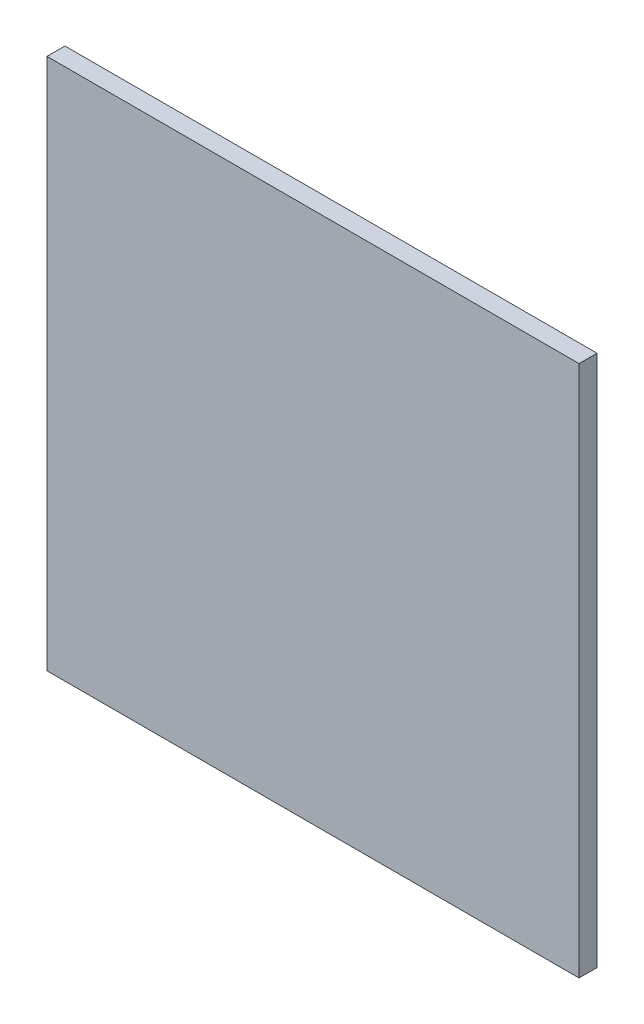
ISO-10303-21;
HEADER;
FILE_DESCRIPTION(('STEP AP214'),'2;1');
FILE_NAME('part.step','',(''),(''),'','','');
FILE_SCHEMA(('AUTOMOTIVE_DESIGN { 1 0 10303 214 1 1 1 1 }'));
ENDSEC;
DATA;
#1=APPLICATION_CONTEXT('core data for automotive mechanical design processes');
#2=APPLICATION_PROTOCOL_DEFINITION('international standard','automotive_design',2000,#1);
#3=PRODUCT_CONTEXT('',#1,'mechanical');
#4=PRODUCT('Part','Part','',(#3));
#5=PRODUCT_RELATED_PRODUCT_CATEGORY('part','',(#4));
#6=PRODUCT_DEFINITION_FORMATION('','',#4);
#7=PRODUCT_DEFINITION_CONTEXT('part definition',#1,'design');
#8=PRODUCT_DEFINITION('design','',#6,#7);
#9=PRODUCT_DEFINITION_SHAPE('','',#8);
#10=(LENGTH_UNIT() NAMED_UNIT(*) SI_UNIT(.MILLI.,.METRE.));
#11=(NAMED_UNIT(*) PLANE_ANGLE_UNIT() SI_UNIT($,.RADIAN.));
#12=(NAMED_UNIT(*) SI_UNIT($,.STERADIAN.) SOLID_ANGLE_UNIT());
#13=UNCERTAINTY_MEASURE_WITH_UNIT(LENGTH_MEASURE(1.E-05),#10,'distance_accuracy_value','');
#14=(GEOMETRIC_REPRESENTATION_CONTEXT(3) GLOBAL_UNCERTAINTY_ASSIGNED_CONTEXT((#13)) GLOBAL_UNIT_ASSIGNED_CONTEXT((#10,
#11,#12)) REPRESENTATION_CONTEXT('',''));
#15=CARTESIAN_POINT('',(0.,0.,0.));
#16=DIRECTION('',(0.,0.,1.));
#17=DIRECTION('',(1.,0.,0.));
#18=AXIS2_PLACEMENT_3D('',#15,#16,#17);
#19=CARTESIAN_POINT('',(837.2,-684.2,1.5));
#20=DIRECTION('',(0.,-1.,0.));
#21=DIRECTION('',(0.,0.,-1.));
#22=AXIS2_PLACEMENT_3D('',#19,#20,#21);
#23=PLANE('',#22);
#24=DIRECTION('',(-1.,0.,0.));
#25=VECTOR('',#24,1.);
#26=CARTESIAN_POINT('',(837.2,-684.2,0.));
#27=LINE('',#26,#25);
#28=CARTESIAN_POINT('',(837.2,-684.2,0.));
#29=VERTEX_POINT('',#28);
#30=CARTESIAN_POINT('',(792.8,-684.2,0.));
#31=VERTEX_POINT('',#30);
#32=EDGE_CURVE('E79',#29,#31,#27,.T.);
#33=ORIENTED_EDGE('',*,*,#32,.F.);
#34=DIRECTION('',(0.,0.,-1.));
#35=VECTOR('',#34,1.);
#36=CARTESIAN_POINT('',(837.2,-684.2,1.5));
#37=LINE('',#36,#35);
#38=CARTESIAN_POINT('',(837.2,-684.2,1.5));
#39=VERTEX_POINT('',#38);
#40=EDGE_CURVE('E10',#39,#29,#37,.T.);
#41=ORIENTED_EDGE('',*,*,#40,.F.);
#42=DIRECTION('',(-1.,0.,0.));
#43=VECTOR('',#42,1.);
#44=CARTESIAN_POINT('',(837.2,-684.2,1.5));
#45=LINE('',#44,#43);
#46=CARTESIAN_POINT('',(792.8,-684.2,1.5));
#47=VERTEX_POINT('',#46);
#48=EDGE_CURVE('E73',#39,#47,#45,.T.);
#49=ORIENTED_EDGE('',*,*,#48,.T.);
#50=DIRECTION('',(0.,0.,-1.));
#51=VECTOR('',#50,1.);
#52=CARTESIAN_POINT('',(792.8,-684.2,1.5));
#53=LINE('',#52,#51);
#54=EDGE_CURVE('E18',#47,#31,#53,.T.);
#55=ORIENTED_EDGE('',*,*,#54,.T.);
#56=EDGE_LOOP('',(#33,#41,#49,#55));
#57=FACE_BOUND('',#56,.T.);
#58=ADVANCED_FACE('F15',(#57),#23,.T.);
#59=CARTESIAN_POINT('',(837.2,-639.8,1.5));
#60=DIRECTION('',(1.,0.,0.));
#61=DIRECTION('',(0.,0.,-1.));
#62=AXIS2_PLACEMENT_3D('',#59,#60,#61);
#63=PLANE('',#62);
#64=DIRECTION('',(0.,-1.,0.));
#65=VECTOR('',#64,1.);
#66=CARTESIAN_POINT('',(837.2,-639.8,0.));
#67=LINE('',#66,#65);
#68=CARTESIAN_POINT('',(837.2,-639.8,0.));
#69=VERTEX_POINT('',#68);
#70=EDGE_CURVE('E75',#69,#29,#67,.T.);
#71=ORIENTED_EDGE('',*,*,#70,.F.);
#72=DIRECTION('',(0.,0.,-1.));
#73=VECTOR('',#72,1.);
#74=CARTESIAN_POINT('',(837.2,-639.8,1.5));
#75=LINE('',#74,#73);
#76=CARTESIAN_POINT('',(837.2,-639.8,1.5));
#77=VERTEX_POINT('',#76);
#78=EDGE_CURVE('E24',#77,#69,#75,.T.);
#79=ORIENTED_EDGE('',*,*,#78,.F.);
#80=DIRECTION('',(0.,-1.,0.));
#81=VECTOR('',#80,1.);
#82=CARTESIAN_POINT('',(837.2,-639.8,1.5));
#83=LINE('',#82,#81);
#84=EDGE_CURVE('E70',#77,#39,#83,.T.);
#85=ORIENTED_EDGE('',*,*,#84,.T.);
#86=ORIENTED_EDGE('',*,*,#40,.T.);
#87=EDGE_LOOP('',(#71,#79,#85,#86));
#88=FACE_BOUND('',#87,.T.);
#89=ADVANCED_FACE('F89',(#88),#63,.T.);
#90=CARTESIAN_POINT('',(792.8,-639.8,1.5));
#91=DIRECTION('',(0.,1.,0.));
#92=DIRECTION('',(0.,0.,1.));
#93=AXIS2_PLACEMENT_3D('',#90,#91,#92);
#94=PLANE('',#93);
#95=DIRECTION('',(1.,0.,0.));
#96=VECTOR('',#95,1.);
#97=CARTESIAN_POINT('',(792.8,-639.8,0.));
#98=LINE('',#97,#96);
#99=CARTESIAN_POINT('',(792.8,-639.8,0.));
#100=VERTEX_POINT('',#99);
#101=EDGE_CURVE('E65',#100,#69,#98,.T.);
#102=ORIENTED_EDGE('',*,*,#101,.F.);
#103=DIRECTION('',(0.,0.,-1.));
#104=VECTOR('',#103,1.);
#105=CARTESIAN_POINT('',(792.8,-639.8,1.5));
#106=LINE('',#105,#104);
#107=CARTESIAN_POINT('',(792.8,-639.8,1.5));
#108=VERTEX_POINT('',#107);
#109=EDGE_CURVE('E60',#108,#100,#106,.T.);
#110=ORIENTED_EDGE('',*,*,#109,.F.);
#111=DIRECTION('',(1.,0.,0.));
#112=VECTOR('',#111,1.);
#113=CARTESIAN_POINT('',(792.8,-639.8,1.5));
#114=LINE('',#113,#112);
#115=EDGE_CURVE('E63',#108,#77,#114,.T.);
#116=ORIENTED_EDGE('',*,*,#115,.T.);
#117=ORIENTED_EDGE('',*,*,#78,.T.);
#118=EDGE_LOOP('',(#102,#110,#116,#117));
#119=FACE_BOUND('',#118,.T.);
#120=ADVANCED_FACE('F62',(#119),#94,.T.);
#121=CARTESIAN_POINT('',(792.8,-684.2,1.5));
#122=DIRECTION('',(-1.,0.,0.));
#123=DIRECTION('',(0.,-1.,0.));
#124=AXIS2_PLACEMENT_3D('',#121,#122,#123);
#125=PLANE('',#124);
#126=DIRECTION('',(0.,1.,0.));
#127=VECTOR('',#126,1.);
#128=CARTESIAN_POINT('',(792.8,-684.2,0.));
#129=LINE('',#128,#127);
#130=EDGE_CURVE('E82',#31,#100,#129,.T.);
#131=ORIENTED_EDGE('',*,*,#130,.F.);
#132=ORIENTED_EDGE('',*,*,#54,.F.);
#133=DIRECTION('',(0.,1.,0.));
#134=VECTOR('',#133,1.);
#135=CARTESIAN_POINT('',(792.8,-684.2,1.5));
#136=LINE('',#135,#134);
#137=EDGE_CURVE('E69',#47,#108,#136,.T.);
#138=ORIENTED_EDGE('',*,*,#137,.T.);
#139=ORIENTED_EDGE('',*,*,#109,.T.);
#140=EDGE_LOOP('',(#131,#132,#138,#139));
#141=FACE_BOUND('',#140,.T.);
#142=ADVANCED_FACE('F72',(#141),#125,.T.);
#143=CARTESIAN_POINT('',(0.,0.,1.5));
#144=DIRECTION('',(0.,0.,-1.));
#145=DIRECTION('',(-1.,0.,0.));
#146=AXIS2_PLACEMENT_3D('',#143,#144,#145);
#147=PLANE('',#146);
#148=ORIENTED_EDGE('',*,*,#48,.F.);
#149=ORIENTED_EDGE('',*,*,#84,.F.);
#150=ORIENTED_EDGE('',*,*,#115,.F.);
#151=ORIENTED_EDGE('',*,*,#137,.F.);
#152=EDGE_LOOP('',(#148,#149,#150,#151));
#153=FACE_BOUND('',#152,.T.);
#154=ADVANCED_FACE('F68',(#153),#147,.F.);
#155=CARTESIAN_POINT('',(0.,0.,0.));
#156=DIRECTION('',(0.,0.,-1.));
#157=DIRECTION('',(-1.,0.,0.));
#158=AXIS2_PLACEMENT_3D('',#155,#156,#157);
#159=PLANE('',#158);
#160=ORIENTED_EDGE('',*,*,#32,.T.);
#161=ORIENTED_EDGE('',*,*,#130,.T.);
#162=ORIENTED_EDGE('',*,*,#101,.T.);
#163=ORIENTED_EDGE('',*,*,#70,.T.);
#164=EDGE_LOOP('',(#160,#161,#162,#163));
#165=FACE_BOUND('',#164,.T.);
#166=ADVANCED_FACE('F88',(#165),#159,.T.);
#167=CLOSED_SHELL('',(#58,#89,#120,#142,#154,#166));
#168=MANIFOLD_SOLID_BREP('B1',#167);
#169=ADVANCED_BREP_SHAPE_REPRESENTATION('',(#18,#168),#14);
#170=SHAPE_DEFINITION_REPRESENTATION(#9,#169);
ENDSEC;
END-ISO-10303-21;
